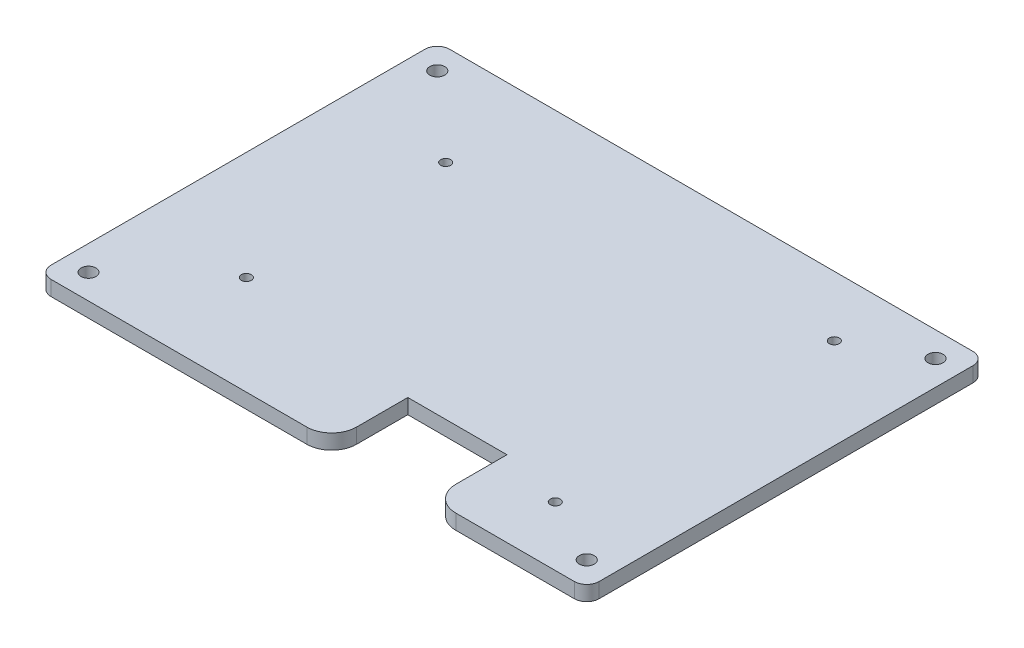
ISO-10303-21;
HEADER;
FILE_DESCRIPTION(('STEP AP214'),'2;1');
FILE_NAME('part.step','',(''),(''),'','','');
FILE_SCHEMA(('AUTOMOTIVE_DESIGN { 1 0 10303 214 1 1 1 1 }'));
ENDSEC;
DATA;
#1=APPLICATION_CONTEXT('core data for automotive mechanical design processes');
#2=APPLICATION_PROTOCOL_DEFINITION('international standard','automotive_design',2000,#1);
#3=PRODUCT_CONTEXT('',#1,'mechanical');
#4=PRODUCT('Part','Part','',(#3));
#5=PRODUCT_RELATED_PRODUCT_CATEGORY('part','',(#4));
#6=PRODUCT_DEFINITION_FORMATION('','',#4);
#7=PRODUCT_DEFINITION_CONTEXT('part definition',#1,'design');
#8=PRODUCT_DEFINITION('design','',#6,#7);
#9=PRODUCT_DEFINITION_SHAPE('','',#8);
#10=(LENGTH_UNIT() NAMED_UNIT(*) SI_UNIT(.MILLI.,.METRE.));
#11=(NAMED_UNIT(*) PLANE_ANGLE_UNIT() SI_UNIT($,.RADIAN.));
#12=(NAMED_UNIT(*) SI_UNIT($,.STERADIAN.) SOLID_ANGLE_UNIT());
#13=UNCERTAINTY_MEASURE_WITH_UNIT(LENGTH_MEASURE(1.E-05),#10,'distance_accuracy_value','');
#14=(GEOMETRIC_REPRESENTATION_CONTEXT(3) GLOBAL_UNCERTAINTY_ASSIGNED_CONTEXT((#13)) GLOBAL_UNIT_ASSIGNED_CONTEXT((#10,
#11,#12)) REPRESENTATION_CONTEXT('',''));
#15=CARTESIAN_POINT('',(0.,0.,0.));
#16=DIRECTION('',(0.,0.,1.));
#17=DIRECTION('',(1.,0.,0.));
#18=AXIS2_PLACEMENT_3D('',#15,#16,#17);
#19=CARTESIAN_POINT('',(0.,3.,0.));
#20=DIRECTION('',(0.,-1.,0.));
#21=DIRECTION('',(0.,0.,-1.));
#22=AXIS2_PLACEMENT_3D('',#19,#20,#21);
#23=PLANE('',#22);
#24=CARTESIAN_POINT('',(91.7648877358585,3.,-11.9207571297093));
#25=DIRECTION('',(0.,1.,0.));
#26=DIRECTION('',(0.,0.,1.));
#27=AXIS2_PLACEMENT_3D('',#24,#25,#26);
#28=CIRCLE('',#27,0.999999999999998);
#29=CARTESIAN_POINT('',(91.7648877358585,3.,-10.9207571297093));
#30=VERTEX_POINT('',#29);
#31=EDGE_CURVE('E255',#30,#30,#28,.T.);
#32=ORIENTED_EDGE('',*,*,#31,.F.);
#33=EDGE_LOOP('',(#32));
#34=FACE_BOUND('',#33,.T.);
#35=CARTESIAN_POINT('',(21.76488836408,3.,-59.9207626266457));
#36=DIRECTION('',(0.,1.,0.));
#37=DIRECTION('',(0.,0.,1.));
#38=AXIS2_PLACEMENT_3D('',#35,#36,#37);
#39=CIRCLE('',#38,1.00000000000001);
#40=CARTESIAN_POINT('',(21.76488836408,3.,-58.9207626266457));
#41=VERTEX_POINT('',#40);
#42=EDGE_CURVE('E267',#41,#41,#39,.T.);
#43=ORIENTED_EDGE('',*,*,#42,.F.);
#44=EDGE_LOOP('',(#43));
#45=FACE_BOUND('',#44,.T.);
#46=CARTESIAN_POINT('',(91.7648877358585,3.,-67.9207571297092));
#47=DIRECTION('',(0.,1.,0.));
#48=DIRECTION('',(0.,0.,1.));
#49=AXIS2_PLACEMENT_3D('',#46,#47,#48);
#50=CIRCLE('',#49,0.999999999999998);
#51=CARTESIAN_POINT('',(91.7648877358585,3.,-66.9207571297092));
#52=VERTEX_POINT('',#51);
#53=EDGE_CURVE('E273',#52,#52,#50,.T.);
#54=ORIENTED_EDGE('',*,*,#53,.F.);
#55=EDGE_LOOP('',(#54));
#56=FACE_BOUND('',#55,.T.);
#57=CARTESIAN_POINT('',(21.76488836408,3.,-19.9207626266464));
#58=DIRECTION('',(0.,1.,0.));
#59=DIRECTION('',(0.,0.,1.));
#60=AXIS2_PLACEMENT_3D('',#57,#58,#59);
#61=CIRCLE('',#60,1.00000000000001);
#62=CARTESIAN_POINT('',(21.76488836408,3.,-18.9207626266464));
#63=VERTEX_POINT('',#62);
#64=EDGE_CURVE('E261',#63,#63,#61,.T.);
#65=ORIENTED_EDGE('',*,*,#64,.F.);
#66=EDGE_LOOP('',(#65));
#67=FACE_BOUND('',#66,.T.);
#68=CARTESIAN_POINT('',(5.,3.,-75.));
#69=DIRECTION('',(0.,1.,0.));
#70=DIRECTION('',(0.,0.,1.));
#71=AXIS2_PLACEMENT_3D('',#68,#69,#70);
#72=CIRCLE('',#71,1.5);
#73=CARTESIAN_POINT('',(5.,3.,-73.5));
#74=VERTEX_POINT('',#73);
#75=EDGE_CURVE('E246',#74,#74,#72,.T.);
#76=ORIENTED_EDGE('',*,*,#75,.F.);
#77=EDGE_LOOP('',(#76));
#78=FACE_BOUND('',#77,.T.);
#79=CARTESIAN_POINT('',(105.,3.,-75.));
#80=DIRECTION('',(0.,1.,0.));
#81=DIRECTION('',(0.,0.,1.));
#82=AXIS2_PLACEMENT_3D('',#79,#80,#81);
#83=CIRCLE('',#82,1.5);
#84=CARTESIAN_POINT('',(105.,3.,-73.5));
#85=VERTEX_POINT('',#84);
#86=EDGE_CURVE('E240',#85,#85,#83,.T.);
#87=ORIENTED_EDGE('',*,*,#86,.F.);
#88=EDGE_LOOP('',(#87));
#89=FACE_BOUND('',#88,.T.);
#90=CARTESIAN_POINT('',(105.,3.,-5.));
#91=DIRECTION('',(0.,1.,0.));
#92=DIRECTION('',(0.,0.,1.));
#93=AXIS2_PLACEMENT_3D('',#90,#91,#92);
#94=CIRCLE('',#93,1.5);
#95=CARTESIAN_POINT('',(105.,3.,-3.5));
#96=VERTEX_POINT('',#95);
#97=EDGE_CURVE('E235',#96,#96,#94,.T.);
#98=ORIENTED_EDGE('',*,*,#97,.F.);
#99=EDGE_LOOP('',(#98));
#100=FACE_BOUND('',#99,.T.);
#101=CARTESIAN_POINT('',(5.,3.,-5.));
#102=DIRECTION('',(0.,1.,0.));
#103=DIRECTION('',(0.,0.,1.));
#104=AXIS2_PLACEMENT_3D('',#101,#102,#103);
#105=CIRCLE('',#104,1.5);
#106=CARTESIAN_POINT('',(5.,3.,-3.5));
#107=VERTEX_POINT('',#106);
#108=EDGE_CURVE('E225',#107,#107,#105,.T.);
#109=ORIENTED_EDGE('',*,*,#108,.F.);
#110=EDGE_LOOP('',(#109));
#111=FACE_BOUND('',#110,.T.);
#112=DIRECTION('',(0.,0.,-1.));
#113=VECTOR('',#112,1.);
#114=CARTESIAN_POINT('',(78.7148834874029,3.,0.));
#115=LINE('',#114,#113);
#116=CARTESIAN_POINT('',(78.7148834874029,3.,-5.));
#117=VERTEX_POINT('',#116);
#118=CARTESIAN_POINT('',(78.7148834874029,3.,-15.2707600329898));
#119=VERTEX_POINT('',#118);
#120=EDGE_CURVE('E377',#117,#119,#115,.T.);
#121=ORIENTED_EDGE('',*,*,#120,.F.);
#122=CARTESIAN_POINT('',(83.7148834874029,3.,-5.));
#123=DIRECTION('',(0.,-1.,0.));
#124=DIRECTION('',(0.,0.,-1.));
#125=AXIS2_PLACEMENT_3D('',#122,#123,#124);
#126=CIRCLE('',#125,5.);
#127=CARTESIAN_POINT('',(83.7148834874029,3.,0.));
#128=VERTEX_POINT('',#127);
#129=EDGE_CURVE('E211',#117,#128,#126,.F.);
#130=ORIENTED_EDGE('',*,*,#129,.T.);
#131=DIRECTION('',(1.,0.,0.));
#132=VECTOR('',#131,1.);
#133=CARTESIAN_POINT('',(0.,3.,0.));
#134=LINE('',#133,#132);
#135=CARTESIAN_POINT('',(107.5,3.,0.));
#136=VERTEX_POINT('',#135);
#137=EDGE_CURVE('E165',#128,#136,#134,.T.);
#138=ORIENTED_EDGE('',*,*,#137,.T.);
#139=CARTESIAN_POINT('',(107.5,3.,-2.5));
#140=DIRECTION('',(0.,-1.,0.));
#141=DIRECTION('',(0.,0.,-1.));
#142=AXIS2_PLACEMENT_3D('',#139,#140,#141);
#143=CIRCLE('',#142,2.5);
#144=CARTESIAN_POINT('',(110.,3.,-2.5));
#145=VERTEX_POINT('',#144);
#146=EDGE_CURVE('E184',#136,#145,#143,.F.);
#147=ORIENTED_EDGE('',*,*,#146,.T.);
#148=DIRECTION('',(0.,0.,-1.));
#149=VECTOR('',#148,1.);
#150=CARTESIAN_POINT('',(110.,3.,0.));
#151=LINE('',#150,#149);
#152=CARTESIAN_POINT('',(110.,3.,-77.5));
#153=VERTEX_POINT('',#152);
#154=EDGE_CURVE('E281',#145,#153,#151,.T.);
#155=ORIENTED_EDGE('',*,*,#154,.T.);
#156=CARTESIAN_POINT('',(107.5,3.,-77.5));
#157=DIRECTION('',(0.,-1.,0.));
#158=DIRECTION('',(0.,0.,-1.));
#159=AXIS2_PLACEMENT_3D('',#156,#157,#158);
#160=CIRCLE('',#159,2.5);
#161=CARTESIAN_POINT('',(107.5,3.,-80.));
#162=VERTEX_POINT('',#161);
#163=EDGE_CURVE('E186',#153,#162,#160,.F.);
#164=ORIENTED_EDGE('',*,*,#163,.T.);
#165=DIRECTION('',(-1.,0.,0.));
#166=VECTOR('',#165,1.);
#167=CARTESIAN_POINT('',(0.,3.,-80.));
#168=LINE('',#167,#166);
#169=CARTESIAN_POINT('',(2.5,3.,-80.));
#170=VERTEX_POINT('',#169);
#171=EDGE_CURVE('E154',#162,#170,#168,.T.);
#172=ORIENTED_EDGE('',*,*,#171,.T.);
#173=CARTESIAN_POINT('',(2.5,3.,-77.5));
#174=DIRECTION('',(0.,-1.,0.));
#175=DIRECTION('',(0.,0.,-1.));
#176=AXIS2_PLACEMENT_3D('',#173,#174,#175);
#177=CIRCLE('',#176,2.5);
#178=CARTESIAN_POINT('',(0.,3.,-77.5));
#179=VERTEX_POINT('',#178);
#180=EDGE_CURVE('E180',#170,#179,#177,.F.);
#181=ORIENTED_EDGE('',*,*,#180,.T.);
#182=DIRECTION('',(0.,0.,1.));
#183=VECTOR('',#182,1.);
#184=CARTESIAN_POINT('',(0.,3.,0.));
#185=LINE('',#184,#183);
#186=CARTESIAN_POINT('',(0.,3.,-2.5));
#187=VERTEX_POINT('',#186);
#188=EDGE_CURVE('E161',#179,#187,#185,.T.);
#189=ORIENTED_EDGE('',*,*,#188,.T.);
#190=CARTESIAN_POINT('',(2.5,3.,-2.5));
#191=DIRECTION('',(0.,-1.,0.));
#192=DIRECTION('',(0.,0.,-1.));
#193=AXIS2_PLACEMENT_3D('',#190,#191,#192);
#194=CIRCLE('',#193,2.5);
#195=CARTESIAN_POINT('',(2.5,3.,0.));
#196=VERTEX_POINT('',#195);
#197=EDGE_CURVE('E182',#187,#196,#194,.F.);
#198=ORIENTED_EDGE('',*,*,#197,.T.);
#199=CARTESIAN_POINT('',(53.8148837079873,3.,0.));
#200=VERTEX_POINT('',#199);
#201=EDGE_CURVE('E279',#196,#200,#134,.T.);
#202=ORIENTED_EDGE('',*,*,#201,.T.);
#203=CARTESIAN_POINT('',(53.8148837079873,3.,-5.));
#204=DIRECTION('',(0.,-1.,0.));
#205=DIRECTION('',(0.,0.,-1.));
#206=AXIS2_PLACEMENT_3D('',#203,#204,#205);
#207=CIRCLE('',#206,5.);
#208=CARTESIAN_POINT('',(58.8148837079873,3.,-5.));
#209=VERTEX_POINT('',#208);
#210=EDGE_CURVE('E53',#200,#209,#207,.F.);
#211=ORIENTED_EDGE('',*,*,#210,.T.);
#212=DIRECTION('',(0.,0.,1.));
#213=VECTOR('',#212,1.);
#214=CARTESIAN_POINT('',(58.8148837079873,3.,-15.2707600329898));
#215=LINE('',#214,#213);
#216=CARTESIAN_POINT('',(58.8148837079873,3.,-15.2707600329898));
#217=VERTEX_POINT('',#216);
#218=EDGE_CURVE('E221',#217,#209,#215,.T.);
#219=ORIENTED_EDGE('',*,*,#218,.F.);
#220=DIRECTION('',(-1.,0.,0.));
#221=VECTOR('',#220,1.);
#222=CARTESIAN_POINT('',(78.7148834874029,3.,-15.2707600329898));
#223=LINE('',#222,#221);
#224=EDGE_CURVE('E379',#119,#217,#223,.T.);
#225=ORIENTED_EDGE('',*,*,#224,.F.);
#226=EDGE_LOOP('',(#121,#130,#138,#147,#155,#164,#172,#181,#189,#198,#202,#211,#219,#225));
#227=FACE_BOUND('',#226,.T.);
#228=ADVANCED_FACE('F33',(#34,#45,#56,#67,#78,#89,#100,#111,#227),#23,.F.);
#229=CARTESIAN_POINT('',(0.,0.,0.));
#230=DIRECTION('',(0.,-1.,0.));
#231=DIRECTION('',(0.,0.,-1.));
#232=AXIS2_PLACEMENT_3D('',#229,#230,#231);
#233=PLANE('',#232);
#234=CARTESIAN_POINT('',(91.7648877358585,0.,-11.9207571297093));
#235=DIRECTION('',(0.,1.,0.));
#236=DIRECTION('',(0.,0.,1.));
#237=AXIS2_PLACEMENT_3D('',#234,#235,#236);
#238=CIRCLE('',#237,0.999999999999998);
#239=CARTESIAN_POINT('',(91.7648877358585,0.,-10.9207571297093));
#240=VERTEX_POINT('',#239);
#241=EDGE_CURVE('E252',#240,#240,#238,.T.);
#242=ORIENTED_EDGE('',*,*,#241,.T.);
#243=EDGE_LOOP('',(#242));
#244=FACE_BOUND('',#243,.T.);
#245=CARTESIAN_POINT('',(21.76488836408,0.,-59.9207626266457));
#246=DIRECTION('',(0.,1.,0.));
#247=DIRECTION('',(0.,0.,1.));
#248=AXIS2_PLACEMENT_3D('',#245,#246,#247);
#249=CIRCLE('',#248,1.00000000000001);
#250=CARTESIAN_POINT('',(21.76488836408,0.,-58.9207626266457));
#251=VERTEX_POINT('',#250);
#252=EDGE_CURVE('E264',#251,#251,#249,.T.);
#253=ORIENTED_EDGE('',*,*,#252,.T.);
#254=EDGE_LOOP('',(#253));
#255=FACE_BOUND('',#254,.T.);
#256=CARTESIAN_POINT('',(91.7648877358585,0.,-67.9207571297092));
#257=DIRECTION('',(0.,1.,0.));
#258=DIRECTION('',(0.,0.,1.));
#259=AXIS2_PLACEMENT_3D('',#256,#257,#258);
#260=CIRCLE('',#259,0.999999999999998);
#261=CARTESIAN_POINT('',(91.7648877358585,0.,-66.9207571297092));
#262=VERTEX_POINT('',#261);
#263=EDGE_CURVE('E270',#262,#262,#260,.T.);
#264=ORIENTED_EDGE('',*,*,#263,.T.);
#265=EDGE_LOOP('',(#264));
#266=FACE_BOUND('',#265,.T.);
#267=CARTESIAN_POINT('',(21.76488836408,0.,-19.9207626266464));
#268=DIRECTION('',(0.,1.,0.));
#269=DIRECTION('',(0.,0.,1.));
#270=AXIS2_PLACEMENT_3D('',#267,#268,#269);
#271=CIRCLE('',#270,1.00000000000001);
#272=CARTESIAN_POINT('',(21.76488836408,0.,-18.9207626266464));
#273=VERTEX_POINT('',#272);
#274=EDGE_CURVE('E258',#273,#273,#271,.T.);
#275=ORIENTED_EDGE('',*,*,#274,.T.);
#276=EDGE_LOOP('',(#275));
#277=FACE_BOUND('',#276,.T.);
#278=CARTESIAN_POINT('',(5.,0.,-75.));
#279=DIRECTION('',(0.,1.,0.));
#280=DIRECTION('',(0.,0.,1.));
#281=AXIS2_PLACEMENT_3D('',#278,#279,#280);
#282=CIRCLE('',#281,1.5);
#283=CARTESIAN_POINT('',(5.,0.,-73.5));
#284=VERTEX_POINT('',#283);
#285=EDGE_CURVE('E249',#284,#284,#282,.T.);
#286=ORIENTED_EDGE('',*,*,#285,.T.);
#287=EDGE_LOOP('',(#286));
#288=FACE_BOUND('',#287,.T.);
#289=CARTESIAN_POINT('',(105.,0.,-75.));
#290=DIRECTION('',(0.,1.,0.));
#291=DIRECTION('',(0.,0.,1.));
#292=AXIS2_PLACEMENT_3D('',#289,#290,#291);
#293=CIRCLE('',#292,1.5);
#294=CARTESIAN_POINT('',(105.,0.,-73.5));
#295=VERTEX_POINT('',#294);
#296=EDGE_CURVE('E243',#295,#295,#293,.T.);
#297=ORIENTED_EDGE('',*,*,#296,.T.);
#298=EDGE_LOOP('',(#297));
#299=FACE_BOUND('',#298,.T.);
#300=CARTESIAN_POINT('',(105.,0.,-5.));
#301=DIRECTION('',(0.,1.,0.));
#302=DIRECTION('',(0.,0.,1.));
#303=AXIS2_PLACEMENT_3D('',#300,#301,#302);
#304=CIRCLE('',#303,1.5);
#305=CARTESIAN_POINT('',(105.,0.,-3.5));
#306=VERTEX_POINT('',#305);
#307=EDGE_CURVE('E237',#306,#306,#304,.T.);
#308=ORIENTED_EDGE('',*,*,#307,.T.);
#309=EDGE_LOOP('',(#308));
#310=FACE_BOUND('',#309,.T.);
#311=CARTESIAN_POINT('',(5.,0.,-5.));
#312=DIRECTION('',(0.,1.,0.));
#313=DIRECTION('',(0.,0.,1.));
#314=AXIS2_PLACEMENT_3D('',#311,#312,#313);
#315=CIRCLE('',#314,1.5);
#316=CARTESIAN_POINT('',(5.,0.,-3.5));
#317=VERTEX_POINT('',#316);
#318=EDGE_CURVE('E229',#317,#317,#315,.T.);
#319=ORIENTED_EDGE('',*,*,#318,.T.);
#320=EDGE_LOOP('',(#319));
#321=FACE_BOUND('',#320,.T.);
#322=DIRECTION('',(1.,0.,0.));
#323=VECTOR('',#322,1.);
#324=CARTESIAN_POINT('',(0.,0.,0.));
#325=LINE('',#324,#323);
#326=CARTESIAN_POINT('',(83.7148834874029,0.,0.));
#327=VERTEX_POINT('',#326);
#328=CARTESIAN_POINT('',(107.5,0.,0.));
#329=VERTEX_POINT('',#328);
#330=EDGE_CURVE('E286',#327,#329,#325,.T.);
#331=ORIENTED_EDGE('',*,*,#330,.F.);
#332=CARTESIAN_POINT('',(83.7148834874029,0.,-5.));
#333=DIRECTION('',(0.,-1.,0.));
#334=DIRECTION('',(0.,0.,-1.));
#335=AXIS2_PLACEMENT_3D('',#332,#333,#334);
#336=CIRCLE('',#335,5.);
#337=CARTESIAN_POINT('',(78.7148834874029,0.,-5.));
#338=VERTEX_POINT('',#337);
#339=EDGE_CURVE('E206',#327,#338,#336,.T.);
#340=ORIENTED_EDGE('',*,*,#339,.T.);
#341=DIRECTION('',(0.,0.,-1.));
#342=VECTOR('',#341,1.);
#343=CARTESIAN_POINT('',(78.7148834874029,0.,0.));
#344=LINE('',#343,#342);
#345=CARTESIAN_POINT('',(78.7148834874029,0.,-15.2707600329898));
#346=VERTEX_POINT('',#345);
#347=EDGE_CURVE('E226',#338,#346,#344,.T.);
#348=ORIENTED_EDGE('',*,*,#347,.T.);
#349=DIRECTION('',(-1.,0.,0.));
#350=VECTOR('',#349,1.);
#351=CARTESIAN_POINT('',(0.,0.,-15.2707600329898));
#352=LINE('',#351,#350);
#353=CARTESIAN_POINT('',(58.8148837079873,0.,-15.2707600329898));
#354=VERTEX_POINT('',#353);
#355=EDGE_CURVE('E199',#346,#354,#352,.T.);
#356=ORIENTED_EDGE('',*,*,#355,.T.);
#357=DIRECTION('',(0.,0.,1.));
#358=VECTOR('',#357,1.);
#359=CARTESIAN_POINT('',(58.8148837079873,0.,0.));
#360=LINE('',#359,#358);
#361=CARTESIAN_POINT('',(58.8148837079873,0.,-5.));
#362=VERTEX_POINT('',#361);
#363=EDGE_CURVE('E219',#354,#362,#360,.T.);
#364=ORIENTED_EDGE('',*,*,#363,.T.);
#365=CARTESIAN_POINT('',(53.8148837079873,0.,-5.));
#366=DIRECTION('',(0.,-1.,0.));
#367=DIRECTION('',(0.,0.,-1.));
#368=AXIS2_PLACEMENT_3D('',#365,#366,#367);
#369=CIRCLE('',#368,5.);
#370=CARTESIAN_POINT('',(53.8148837079873,0.,0.));
#371=VERTEX_POINT('',#370);
#372=EDGE_CURVE('E204',#362,#371,#369,.T.);
#373=ORIENTED_EDGE('',*,*,#372,.T.);
#374=CARTESIAN_POINT('',(2.5,0.,0.));
#375=VERTEX_POINT('',#374);
#376=EDGE_CURVE('E167',#375,#371,#325,.T.);
#377=ORIENTED_EDGE('',*,*,#376,.F.);
#378=CARTESIAN_POINT('',(2.5,0.,-2.5));
#379=DIRECTION('',(0.,-1.,0.));
#380=DIRECTION('',(0.,0.,-1.));
#381=AXIS2_PLACEMENT_3D('',#378,#379,#380);
#382=CIRCLE('',#381,2.5);
#383=CARTESIAN_POINT('',(0.,0.,-2.5));
#384=VERTEX_POINT('',#383);
#385=EDGE_CURVE('E173',#375,#384,#382,.T.);
#386=ORIENTED_EDGE('',*,*,#385,.T.);
#387=DIRECTION('',(0.,0.,1.));
#388=VECTOR('',#387,1.);
#389=CARTESIAN_POINT('',(0.,0.,0.));
#390=LINE('',#389,#388);
#391=CARTESIAN_POINT('',(0.,0.,-77.5));
#392=VERTEX_POINT('',#391);
#393=EDGE_CURVE('E276',#392,#384,#390,.T.);
#394=ORIENTED_EDGE('',*,*,#393,.F.);
#395=CARTESIAN_POINT('',(2.5,0.,-77.5));
#396=DIRECTION('',(0.,-1.,0.));
#397=DIRECTION('',(0.,0.,-1.));
#398=AXIS2_PLACEMENT_3D('',#395,#396,#397);
#399=CIRCLE('',#398,2.5);
#400=CARTESIAN_POINT('',(2.5,0.,-80.));
#401=VERTEX_POINT('',#400);
#402=EDGE_CURVE('E155',#392,#401,#399,.T.);
#403=ORIENTED_EDGE('',*,*,#402,.T.);
#404=DIRECTION('',(-1.,0.,0.));
#405=VECTOR('',#404,1.);
#406=CARTESIAN_POINT('',(0.,0.,-80.));
#407=LINE('',#406,#405);
#408=CARTESIAN_POINT('',(107.5,0.,-80.));
#409=VERTEX_POINT('',#408);
#410=EDGE_CURVE('E151',#409,#401,#407,.T.);
#411=ORIENTED_EDGE('',*,*,#410,.F.);
#412=CARTESIAN_POINT('',(107.5,0.,-77.5));
#413=DIRECTION('',(0.,-1.,0.));
#414=DIRECTION('',(0.,0.,-1.));
#415=AXIS2_PLACEMENT_3D('',#412,#413,#414);
#416=CIRCLE('',#415,2.5);
#417=CARTESIAN_POINT('',(110.,0.,-77.5));
#418=VERTEX_POINT('',#417);
#419=EDGE_CURVE('E134',#409,#418,#416,.T.);
#420=ORIENTED_EDGE('',*,*,#419,.T.);
#421=DIRECTION('',(0.,0.,-1.));
#422=VECTOR('',#421,1.);
#423=CARTESIAN_POINT('',(110.,0.,0.));
#424=LINE('',#423,#422);
#425=CARTESIAN_POINT('',(110.,0.,-2.5));
#426=VERTEX_POINT('',#425);
#427=EDGE_CURVE('E162',#426,#418,#424,.T.);
#428=ORIENTED_EDGE('',*,*,#427,.F.);
#429=CARTESIAN_POINT('',(107.5,0.,-2.5));
#430=DIRECTION('',(0.,-1.,0.));
#431=DIRECTION('',(0.,0.,-1.));
#432=AXIS2_PLACEMENT_3D('',#429,#430,#431);
#433=CIRCLE('',#432,2.5);
#434=EDGE_CURVE('E145',#426,#329,#433,.T.);
#435=ORIENTED_EDGE('',*,*,#434,.T.);
#436=EDGE_LOOP('',(#331,#340,#348,#356,#364,#373,#377,#386,#394,#403,#411,#420,#428,#435));
#437=FACE_BOUND('',#436,.T.);
#438=ADVANCED_FACE('F159',(#244,#255,#266,#277,#288,#299,#310,#321,#437),#233,.T.);
#439=CARTESIAN_POINT('',(0.,3.,0.));
#440=DIRECTION('',(0.,0.,-1.));
#441=DIRECTION('',(-1.,0.,0.));
#442=AXIS2_PLACEMENT_3D('',#439,#440,#441);
#443=PLANE('',#442);
#444=ORIENTED_EDGE('',*,*,#376,.T.);
#445=DIRECTION('',(0.,-1.,0.));
#446=VECTOR('',#445,1.);
#447=CARTESIAN_POINT('',(53.8148837079873,3.,0.));
#448=LINE('',#447,#446);
#449=EDGE_CURVE('E11',#371,#200,#448,.F.);
#450=ORIENTED_EDGE('',*,*,#449,.T.);
#451=ORIENTED_EDGE('',*,*,#201,.F.);
#452=DIRECTION('',(0.,-1.,0.));
#453=VECTOR('',#452,1.);
#454=CARTESIAN_POINT('',(2.5,3.,0.));
#455=LINE('',#454,#453);
#456=EDGE_CURVE('E188',#196,#375,#455,.T.);
#457=ORIENTED_EDGE('',*,*,#456,.T.);
#458=EDGE_LOOP('',(#444,#450,#451,#457));
#459=FACE_BOUND('',#458,.T.);
#460=ADVANCED_FACE('F318',(#459),#443,.F.);
#461=ORIENTED_EDGE('',*,*,#137,.F.);
#462=DIRECTION('',(0.,-1.,0.));
#463=VECTOR('',#462,1.);
#464=CARTESIAN_POINT('',(83.7148834874029,0.,0.));
#465=LINE('',#464,#463);
#466=EDGE_CURVE('E201',#128,#327,#465,.T.);
#467=ORIENTED_EDGE('',*,*,#466,.T.);
#468=ORIENTED_EDGE('',*,*,#330,.T.);
#469=DIRECTION('',(0.,-1.,0.));
#470=VECTOR('',#469,1.);
#471=CARTESIAN_POINT('',(107.5,3.,0.));
#472=LINE('',#471,#470);
#473=EDGE_CURVE('E191',#329,#136,#472,.F.);
#474=ORIENTED_EDGE('',*,*,#473,.T.);
#475=EDGE_LOOP('',(#461,#467,#468,#474));
#476=FACE_BOUND('',#475,.T.);
#477=ADVANCED_FACE('F289',(#476),#443,.F.);
#478=CARTESIAN_POINT('',(0.,3.,0.));
#479=DIRECTION('',(1.,0.,0.));
#480=DIRECTION('',(0.,0.,-1.));
#481=AXIS2_PLACEMENT_3D('',#478,#479,#480);
#482=PLANE('',#481);
#483=ORIENTED_EDGE('',*,*,#393,.T.);
#484=DIRECTION('',(0.,-1.,0.));
#485=VECTOR('',#484,1.);
#486=CARTESIAN_POINT('',(0.,3.,-2.5));
#487=LINE('',#486,#485);
#488=EDGE_CURVE('E197',#384,#187,#487,.F.);
#489=ORIENTED_EDGE('',*,*,#488,.T.);
#490=ORIENTED_EDGE('',*,*,#188,.F.);
#491=DIRECTION('',(0.,-1.,0.));
#492=VECTOR('',#491,1.);
#493=CARTESIAN_POINT('',(0.,3.,-77.5));
#494=LINE('',#493,#492);
#495=EDGE_CURVE('E194',#179,#392,#494,.T.);
#496=ORIENTED_EDGE('',*,*,#495,.T.);
#497=EDGE_LOOP('',(#483,#489,#490,#496));
#498=FACE_BOUND('',#497,.T.);
#499=ADVANCED_FACE('F301',(#498),#482,.F.);
#500=CARTESIAN_POINT('',(110.,3.,0.));
#501=DIRECTION('',(-1.,0.,0.));
#502=DIRECTION('',(0.,0.,1.));
#503=AXIS2_PLACEMENT_3D('',#500,#501,#502);
#504=PLANE('',#503);
#505=ORIENTED_EDGE('',*,*,#427,.T.);
#506=DIRECTION('',(0.,-1.,0.));
#507=VECTOR('',#506,1.);
#508=CARTESIAN_POINT('',(110.,3.,-77.5));
#509=LINE('',#508,#507);
#510=EDGE_CURVE('E139',#418,#153,#509,.F.);
#511=ORIENTED_EDGE('',*,*,#510,.T.);
#512=ORIENTED_EDGE('',*,*,#154,.F.);
#513=DIRECTION('',(0.,-1.,0.));
#514=VECTOR('',#513,1.);
#515=CARTESIAN_POINT('',(110.,3.,-2.5));
#516=LINE('',#515,#514);
#517=EDGE_CURVE('E144',#145,#426,#516,.T.);
#518=ORIENTED_EDGE('',*,*,#517,.T.);
#519=EDGE_LOOP('',(#505,#511,#512,#518));
#520=FACE_BOUND('',#519,.T.);
#521=ADVANCED_FACE('F299',(#520),#504,.F.);
#522=CARTESIAN_POINT('',(0.,3.,-80.));
#523=DIRECTION('',(0.,0.,1.));
#524=DIRECTION('',(1.,0.,0.));
#525=AXIS2_PLACEMENT_3D('',#522,#523,#524);
#526=PLANE('',#525);
#527=ORIENTED_EDGE('',*,*,#171,.F.);
#528=DIRECTION('',(0.,-1.,0.));
#529=VECTOR('',#528,1.);
#530=CARTESIAN_POINT('',(107.5,3.,-80.));
#531=LINE('',#530,#529);
#532=EDGE_CURVE('E138',#162,#409,#531,.T.);
#533=ORIENTED_EDGE('',*,*,#532,.T.);
#534=ORIENTED_EDGE('',*,*,#410,.T.);
#535=DIRECTION('',(0.,-1.,0.));
#536=VECTOR('',#535,1.);
#537=CARTESIAN_POINT('',(2.5,3.,-80.));
#538=LINE('',#537,#536);
#539=EDGE_CURVE('E156',#401,#170,#538,.F.);
#540=ORIENTED_EDGE('',*,*,#539,.T.);
#541=EDGE_LOOP('',(#527,#533,#534,#540));
#542=FACE_BOUND('',#541,.T.);
#543=ADVANCED_FACE('F150',(#542),#526,.F.);
#544=CARTESIAN_POINT('',(91.7648877358585,3.,-67.9207571297092));
#545=DIRECTION('',(0.,-1.,0.));
#546=DIRECTION('',(0.,0.,-1.));
#547=AXIS2_PLACEMENT_3D('',#544,#545,#546);
#548=CYLINDRICAL_SURFACE('',#547,0.999999999999998);
#549=ORIENTED_EDGE('',*,*,#53,.T.);
#550=EDGE_LOOP('',(#549));
#551=FACE_BOUND('',#550,.T.);
#552=ORIENTED_EDGE('',*,*,#263,.F.);
#553=EDGE_LOOP('',(#552));
#554=FACE_BOUND('',#553,.T.);
#555=ADVANCED_FACE('F307',(#551,#554),#548,.F.);
#556=CARTESIAN_POINT('',(21.76488836408,3.,-59.9207626266457));
#557=DIRECTION('',(0.,-1.,0.));
#558=DIRECTION('',(0.,0.,-1.));
#559=AXIS2_PLACEMENT_3D('',#556,#557,#558);
#560=CYLINDRICAL_SURFACE('',#559,1.00000000000001);
#561=ORIENTED_EDGE('',*,*,#42,.T.);
#562=EDGE_LOOP('',(#561));
#563=FACE_BOUND('',#562,.T.);
#564=ORIENTED_EDGE('',*,*,#252,.F.);
#565=EDGE_LOOP('',(#564));
#566=FACE_BOUND('',#565,.T.);
#567=ADVANCED_FACE('F326',(#563,#566),#560,.F.);
#568=CARTESIAN_POINT('',(21.76488836408,3.,-19.9207626266464));
#569=DIRECTION('',(0.,-1.,0.));
#570=DIRECTION('',(0.,0.,-1.));
#571=AXIS2_PLACEMENT_3D('',#568,#569,#570);
#572=CYLINDRICAL_SURFACE('',#571,1.00000000000001);
#573=ORIENTED_EDGE('',*,*,#64,.T.);
#574=EDGE_LOOP('',(#573));
#575=FACE_BOUND('',#574,.T.);
#576=ORIENTED_EDGE('',*,*,#274,.F.);
#577=EDGE_LOOP('',(#576));
#578=FACE_BOUND('',#577,.T.);
#579=ADVANCED_FACE('F330',(#575,#578),#572,.F.);
#580=CARTESIAN_POINT('',(91.7648877358585,3.,-11.9207571297093));
#581=DIRECTION('',(0.,-1.,0.));
#582=DIRECTION('',(0.,0.,-1.));
#583=AXIS2_PLACEMENT_3D('',#580,#581,#582);
#584=CYLINDRICAL_SURFACE('',#583,0.999999999999998);
#585=ORIENTED_EDGE('',*,*,#31,.T.);
#586=EDGE_LOOP('',(#585));
#587=FACE_BOUND('',#586,.T.);
#588=ORIENTED_EDGE('',*,*,#241,.F.);
#589=EDGE_LOOP('',(#588));
#590=FACE_BOUND('',#589,.T.);
#591=ADVANCED_FACE('F334',(#587,#590),#584,.F.);
#592=CARTESIAN_POINT('',(5.,0.,-75.));
#593=DIRECTION('',(0.,1.,0.));
#594=DIRECTION('',(0.,0.,1.));
#595=AXIS2_PLACEMENT_3D('',#592,#593,#594);
#596=CYLINDRICAL_SURFACE('',#595,1.5);
#597=ORIENTED_EDGE('',*,*,#285,.F.);
#598=EDGE_LOOP('',(#597));
#599=FACE_BOUND('',#598,.T.);
#600=ORIENTED_EDGE('',*,*,#75,.T.);
#601=EDGE_LOOP('',(#600));
#602=FACE_BOUND('',#601,.T.);
#603=ADVANCED_FACE('F338',(#599,#602),#596,.F.);
#604=CARTESIAN_POINT('',(105.,0.,-75.));
#605=DIRECTION('',(0.,1.,0.));
#606=DIRECTION('',(0.,0.,1.));
#607=AXIS2_PLACEMENT_3D('',#604,#605,#606);
#608=CYLINDRICAL_SURFACE('',#607,1.5);
#609=ORIENTED_EDGE('',*,*,#296,.F.);
#610=EDGE_LOOP('',(#609));
#611=FACE_BOUND('',#610,.T.);
#612=ORIENTED_EDGE('',*,*,#86,.T.);
#613=EDGE_LOOP('',(#612));
#614=FACE_BOUND('',#613,.T.);
#615=ADVANCED_FACE('F342',(#611,#614),#608,.F.);
#616=CARTESIAN_POINT('',(105.,0.,-5.));
#617=DIRECTION('',(0.,1.,0.));
#618=DIRECTION('',(0.,0.,1.));
#619=AXIS2_PLACEMENT_3D('',#616,#617,#618);
#620=CYLINDRICAL_SURFACE('',#619,1.5);
#621=ORIENTED_EDGE('',*,*,#307,.F.);
#622=EDGE_LOOP('',(#621));
#623=FACE_BOUND('',#622,.T.);
#624=ORIENTED_EDGE('',*,*,#97,.T.);
#625=EDGE_LOOP('',(#624));
#626=FACE_BOUND('',#625,.T.);
#627=ADVANCED_FACE('F346',(#623,#626),#620,.F.);
#628=CARTESIAN_POINT('',(5.,0.,-5.));
#629=DIRECTION('',(0.,1.,0.));
#630=DIRECTION('',(0.,0.,1.));
#631=AXIS2_PLACEMENT_3D('',#628,#629,#630);
#632=CYLINDRICAL_SURFACE('',#631,1.5);
#633=ORIENTED_EDGE('',*,*,#318,.F.);
#634=EDGE_LOOP('',(#633));
#635=FACE_BOUND('',#634,.T.);
#636=ORIENTED_EDGE('',*,*,#108,.T.);
#637=EDGE_LOOP('',(#636));
#638=FACE_BOUND('',#637,.T.);
#639=ADVANCED_FACE('F350',(#635,#638),#632,.F.);
#640=CARTESIAN_POINT('',(107.5,3.,-77.5));
#641=DIRECTION('',(0.,-1.,0.));
#642=DIRECTION('',(0.,0.,-1.));
#643=AXIS2_PLACEMENT_3D('',#640,#641,#642);
#644=CYLINDRICAL_SURFACE('',#643,2.5);
#645=ORIENTED_EDGE('',*,*,#163,.F.);
#646=ORIENTED_EDGE('',*,*,#510,.F.);
#647=ORIENTED_EDGE('',*,*,#419,.F.);
#648=ORIENTED_EDGE('',*,*,#532,.F.);
#649=EDGE_LOOP('',(#645,#646,#647,#648));
#650=FACE_BOUND('',#649,.T.);
#651=ADVANCED_FACE('F137',(#650),#644,.T.);
#652=CARTESIAN_POINT('',(107.5,3.,-2.5));
#653=DIRECTION('',(0.,-1.,0.));
#654=DIRECTION('',(0.,0.,-1.));
#655=AXIS2_PLACEMENT_3D('',#652,#653,#654);
#656=CYLINDRICAL_SURFACE('',#655,2.5);
#657=ORIENTED_EDGE('',*,*,#146,.F.);
#658=ORIENTED_EDGE('',*,*,#473,.F.);
#659=ORIENTED_EDGE('',*,*,#434,.F.);
#660=ORIENTED_EDGE('',*,*,#517,.F.);
#661=EDGE_LOOP('',(#657,#658,#659,#660));
#662=FACE_BOUND('',#661,.T.);
#663=ADVANCED_FACE('F295',(#662),#656,.T.);
#664=CARTESIAN_POINT('',(2.5,3.,-2.5));
#665=DIRECTION('',(0.,-1.,0.));
#666=DIRECTION('',(0.,0.,-1.));
#667=AXIS2_PLACEMENT_3D('',#664,#665,#666);
#668=CYLINDRICAL_SURFACE('',#667,2.5);
#669=ORIENTED_EDGE('',*,*,#197,.F.);
#670=ORIENTED_EDGE('',*,*,#488,.F.);
#671=ORIENTED_EDGE('',*,*,#385,.F.);
#672=ORIENTED_EDGE('',*,*,#456,.F.);
#673=EDGE_LOOP('',(#669,#670,#671,#672));
#674=FACE_BOUND('',#673,.T.);
#675=ADVANCED_FACE('F391',(#674),#668,.T.);
#676=CARTESIAN_POINT('',(2.5,3.,-77.5));
#677=DIRECTION('',(0.,-1.,0.));
#678=DIRECTION('',(0.,0.,-1.));
#679=AXIS2_PLACEMENT_3D('',#676,#677,#678);
#680=CYLINDRICAL_SURFACE('',#679,2.5);
#681=ORIENTED_EDGE('',*,*,#180,.F.);
#682=ORIENTED_EDGE('',*,*,#539,.F.);
#683=ORIENTED_EDGE('',*,*,#402,.F.);
#684=ORIENTED_EDGE('',*,*,#495,.F.);
#685=EDGE_LOOP('',(#681,#682,#683,#684));
#686=FACE_BOUND('',#685,.T.);
#687=ADVANCED_FACE('F358',(#686),#680,.T.);
#688=CARTESIAN_POINT('',(58.8148837079873,3.,-15.2707600329898));
#689=DIRECTION('',(1.,0.,0.));
#690=DIRECTION('',(0.,0.,-1.));
#691=AXIS2_PLACEMENT_3D('',#688,#689,#690);
#692=PLANE('',#691);
#693=ORIENTED_EDGE('',*,*,#218,.T.);
#694=DIRECTION('',(0.,-1.,0.));
#695=VECTOR('',#694,1.);
#696=CARTESIAN_POINT('',(58.8148837079873,0.,-5.));
#697=LINE('',#696,#695);
#698=EDGE_CURVE('E41',#209,#362,#697,.T.);
#699=ORIENTED_EDGE('',*,*,#698,.T.);
#700=ORIENTED_EDGE('',*,*,#363,.F.);
#701=DIRECTION('',(0.,-1.,0.));
#702=VECTOR('',#701,1.);
#703=CARTESIAN_POINT('',(58.8148837079873,3.,-15.2707600329898));
#704=LINE('',#703,#702);
#705=EDGE_CURVE('E384',#217,#354,#704,.T.);
#706=ORIENTED_EDGE('',*,*,#705,.F.);
#707=EDGE_LOOP('',(#693,#699,#700,#706));
#708=FACE_BOUND('',#707,.T.);
#709=ADVANCED_FACE('F217',(#708),#692,.T.);
#710=CARTESIAN_POINT('',(78.7148834874029,3.,-15.2707600329898));
#711=DIRECTION('',(0.,0.,1.));
#712=DIRECTION('',(1.,0.,0.));
#713=AXIS2_PLACEMENT_3D('',#710,#711,#712);
#714=PLANE('',#713);
#715=ORIENTED_EDGE('',*,*,#355,.F.);
#716=DIRECTION('',(0.,-1.,0.));
#717=VECTOR('',#716,1.);
#718=CARTESIAN_POINT('',(78.7148834874029,3.,-15.2707600329898));
#719=LINE('',#718,#717);
#720=EDGE_CURVE('E374',#119,#346,#719,.T.);
#721=ORIENTED_EDGE('',*,*,#720,.F.);
#722=ORIENTED_EDGE('',*,*,#224,.T.);
#723=ORIENTED_EDGE('',*,*,#705,.T.);
#724=EDGE_LOOP('',(#715,#721,#722,#723));
#725=FACE_BOUND('',#724,.T.);
#726=ADVANCED_FACE('F357',(#725),#714,.T.);
#727=CARTESIAN_POINT('',(78.7148834874029,3.,0.));
#728=DIRECTION('',(-1.,0.,0.));
#729=DIRECTION('',(0.,0.,1.));
#730=AXIS2_PLACEMENT_3D('',#727,#728,#729);
#731=PLANE('',#730);
#732=ORIENTED_EDGE('',*,*,#347,.F.);
#733=DIRECTION('',(0.,-1.,0.));
#734=VECTOR('',#733,1.);
#735=CARTESIAN_POINT('',(78.7148834874029,3.,-5.));
#736=LINE('',#735,#734);
#737=EDGE_CURVE('E208',#338,#117,#736,.F.);
#738=ORIENTED_EDGE('',*,*,#737,.T.);
#739=ORIENTED_EDGE('',*,*,#120,.T.);
#740=ORIENTED_EDGE('',*,*,#720,.T.);
#741=EDGE_LOOP('',(#732,#738,#739,#740));
#742=FACE_BOUND('',#741,.T.);
#743=ADVANCED_FACE('F361',(#742),#731,.T.);
#744=CARTESIAN_POINT('',(83.7148834874029,3.,-5.));
#745=DIRECTION('',(0.,1.,0.));
#746=DIRECTION('',(0.,0.,1.));
#747=AXIS2_PLACEMENT_3D('',#744,#745,#746);
#748=CYLINDRICAL_SURFACE('',#747,5.);
#749=ORIENTED_EDGE('',*,*,#129,.F.);
#750=ORIENTED_EDGE('',*,*,#737,.F.);
#751=ORIENTED_EDGE('',*,*,#339,.F.);
#752=ORIENTED_EDGE('',*,*,#466,.F.);
#753=EDGE_LOOP('',(#749,#750,#751,#752));
#754=FACE_BOUND('',#753,.T.);
#755=ADVANCED_FACE('F364',(#754),#748,.T.);
#756=CARTESIAN_POINT('',(53.8148837079873,3.,-5.));
#757=DIRECTION('',(0.,1.,0.));
#758=DIRECTION('',(0.,0.,1.));
#759=AXIS2_PLACEMENT_3D('',#756,#757,#758);
#760=CYLINDRICAL_SURFACE('',#759,5.);
#761=ORIENTED_EDGE('',*,*,#210,.F.);
#762=ORIENTED_EDGE('',*,*,#449,.F.);
#763=ORIENTED_EDGE('',*,*,#372,.F.);
#764=ORIENTED_EDGE('',*,*,#698,.F.);
#765=EDGE_LOOP('',(#761,#762,#763,#764));
#766=FACE_BOUND('',#765,.T.);
#767=ADVANCED_FACE('F35',(#766),#760,.T.);
#768=CLOSED_SHELL('',(#228,#438,#460,#477,#499,#521,#543,#555,#567,#579,#591,#603,#615,#627,
#639,#651,#663,#675,#687,#709,#726,#743,#755,#767));
#769=MANIFOLD_SOLID_BREP('B2',#768);
#770=ADVANCED_BREP_SHAPE_REPRESENTATION('',(#18,#769),#14);
#771=SHAPE_DEFINITION_REPRESENTATION(#9,#770);
ENDSEC;
END-ISO-10303-21;
